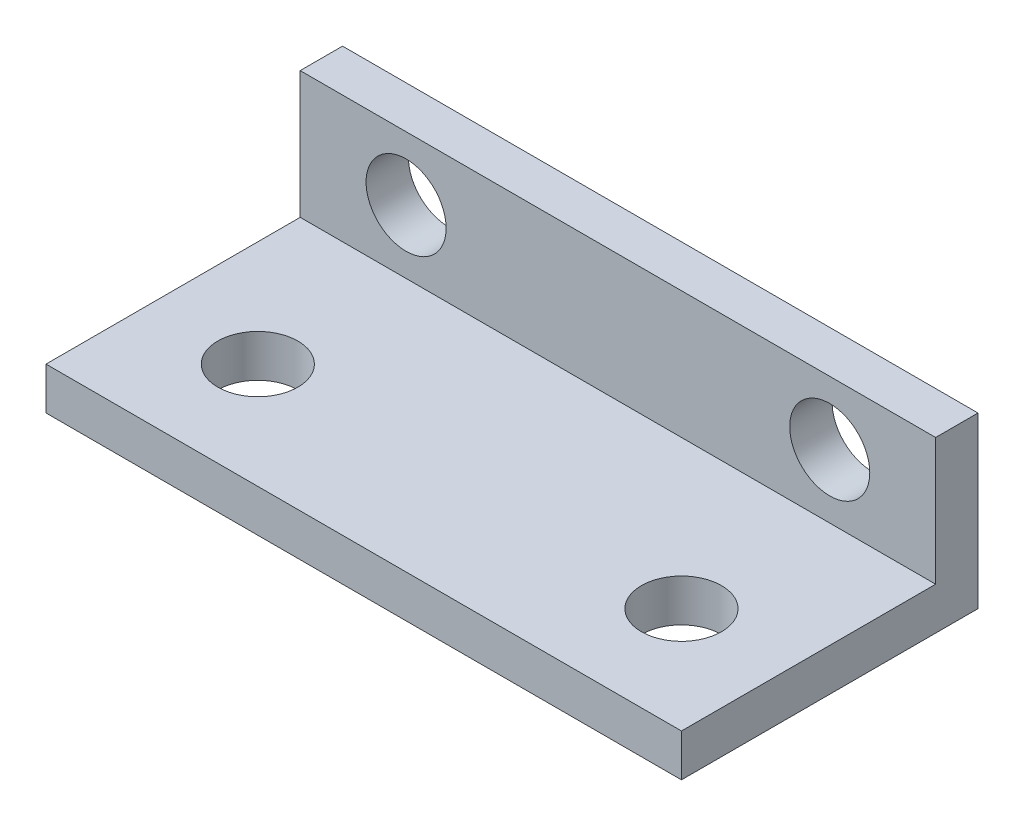
ISO-10303-21;
HEADER;
FILE_DESCRIPTION(('STEP AP214'),'2;1');
FILE_NAME('part.step','',(''),(''),'','','');
FILE_SCHEMA(('AUTOMOTIVE_DESIGN { 1 0 10303 214 1 1 1 1 }'));
ENDSEC;
DATA;
#1=APPLICATION_CONTEXT('core data for automotive mechanical design processes');
#2=APPLICATION_PROTOCOL_DEFINITION('international standard','automotive_design',2000,#1);
#3=PRODUCT_CONTEXT('',#1,'mechanical');
#4=PRODUCT('Part','Part','',(#3));
#5=PRODUCT_RELATED_PRODUCT_CATEGORY('part','',(#4));
#6=PRODUCT_DEFINITION_FORMATION('','',#4);
#7=PRODUCT_DEFINITION_CONTEXT('part definition',#1,'design');
#8=PRODUCT_DEFINITION('design','',#6,#7);
#9=PRODUCT_DEFINITION_SHAPE('','',#8);
#10=(LENGTH_UNIT() NAMED_UNIT(*) SI_UNIT(.MILLI.,.METRE.));
#11=(NAMED_UNIT(*) PLANE_ANGLE_UNIT() SI_UNIT($,.RADIAN.));
#12=(NAMED_UNIT(*) SI_UNIT($,.STERADIAN.) SOLID_ANGLE_UNIT());
#13=UNCERTAINTY_MEASURE_WITH_UNIT(LENGTH_MEASURE(1.E-05),#10,'distance_accuracy_value','');
#14=(GEOMETRIC_REPRESENTATION_CONTEXT(3) GLOBAL_UNCERTAINTY_ASSIGNED_CONTEXT((#13)) GLOBAL_UNIT_ASSIGNED_CONTEXT((#10,
#11,#12)) REPRESENTATION_CONTEXT('',''));
#15=CARTESIAN_POINT('',(0.,0.,0.));
#16=DIRECTION('',(0.,0.,1.));
#17=DIRECTION('',(1.,0.,0.));
#18=AXIS2_PLACEMENT_3D('',#15,#16,#17);
#19=CARTESIAN_POINT('',(38.1,0.,0.));
#20=DIRECTION('',(0.,1.,0.));
#21=DIRECTION('',(0.,0.,1.));
#22=AXIS2_PLACEMENT_3D('',#19,#20,#21);
#23=PLANE('',#22);
#24=CARTESIAN_POINT('',(6.35,0.,1.27));
#25=DIRECTION('',(0.,1.,0.));
#26=DIRECTION('',(0.,0.,1.));
#27=AXIS2_PLACEMENT_3D('',#24,#25,#26);
#28=CIRCLE('',#27,2.4);
#29=CARTESIAN_POINT('',(6.35,0.,3.67));
#30=VERTEX_POINT('',#29);
#31=EDGE_CURVE('E135',#30,#30,#28,.T.);
#32=ORIENTED_EDGE('',*,*,#31,.T.);
#33=EDGE_LOOP('',(#32));
#34=FACE_BOUND('',#33,.T.);
#35=CARTESIAN_POINT('',(31.75,0.,1.27));
#36=DIRECTION('',(0.,1.,0.));
#37=DIRECTION('',(0.,0.,1.));
#38=AXIS2_PLACEMENT_3D('',#35,#36,#37);
#39=CIRCLE('',#38,2.4);
#40=CARTESIAN_POINT('',(31.75,0.,3.67));
#41=VERTEX_POINT('',#40);
#42=EDGE_CURVE('E129',#41,#41,#39,.T.);
#43=ORIENTED_EDGE('',*,*,#42,.T.);
#44=EDGE_LOOP('',(#43));
#45=FACE_BOUND('',#44,.T.);
#46=DIRECTION('',(0.,0.,-1.));
#47=VECTOR('',#46,1.);
#48=CARTESIAN_POINT('',(0.,0.,0.));
#49=LINE('',#48,#47);
#50=CARTESIAN_POINT('',(0.,0.,7.62));
#51=VERTEX_POINT('',#50);
#52=CARTESIAN_POINT('',(0.,0.,-10.16));
#53=VERTEX_POINT('',#52);
#54=EDGE_CURVE('E76',#51,#53,#49,.T.);
#55=ORIENTED_EDGE('',*,*,#54,.T.);
#56=DIRECTION('',(-1.,0.,0.));
#57=VECTOR('',#56,1.);
#58=CARTESIAN_POINT('',(38.1,0.,-10.16));
#59=LINE('',#58,#57);
#60=CARTESIAN_POINT('',(38.1,0.,-10.16));
#61=VERTEX_POINT('',#60);
#62=EDGE_CURVE('E11',#61,#53,#59,.T.);
#63=ORIENTED_EDGE('',*,*,#62,.F.);
#64=DIRECTION('',(0.,0.,-1.));
#65=VECTOR('',#64,1.);
#66=CARTESIAN_POINT('',(38.1,0.,0.));
#67=LINE('',#66,#65);
#68=CARTESIAN_POINT('',(38.1,0.,7.62));
#69=VERTEX_POINT('',#68);
#70=EDGE_CURVE('E85',#69,#61,#67,.T.);
#71=ORIENTED_EDGE('',*,*,#70,.F.);
#72=DIRECTION('',(1.,0.,0.));
#73=VECTOR('',#72,1.);
#74=CARTESIAN_POINT('',(0.,0.,7.62));
#75=LINE('',#74,#73);
#76=EDGE_CURVE('E123',#51,#69,#75,.T.);
#77=ORIENTED_EDGE('',*,*,#76,.F.);
#78=EDGE_LOOP('',(#55,#63,#71,#77));
#79=FACE_BOUND('',#78,.T.);
#80=ADVANCED_FACE('F32',(#34,#45,#79),#23,.F.);
#81=CARTESIAN_POINT('',(38.1,0.,-10.16));
#82=DIRECTION('',(0.,0.,1.));
#83=DIRECTION('',(1.,0.,0.));
#84=AXIS2_PLACEMENT_3D('',#81,#82,#83);
#85=PLANE('',#84);
#86=CARTESIAN_POINT('',(6.35,6.35,-10.16));
#87=DIRECTION('',(0.,0.,1.));
#88=DIRECTION('',(1.,0.,0.));
#89=AXIS2_PLACEMENT_3D('',#86,#87,#88);
#90=CIRCLE('',#89,2.4);
#91=CARTESIAN_POINT('',(8.75,6.35,-10.16));
#92=VERTEX_POINT('',#91);
#93=EDGE_CURVE('E111',#92,#92,#90,.T.);
#94=ORIENTED_EDGE('',*,*,#93,.T.);
#95=EDGE_LOOP('',(#94));
#96=FACE_BOUND('',#95,.T.);
#97=CARTESIAN_POINT('',(31.75,6.35,-10.16));
#98=DIRECTION('',(0.,0.,1.));
#99=DIRECTION('',(1.,0.,0.));
#100=AXIS2_PLACEMENT_3D('',#97,#98,#99);
#101=CIRCLE('',#100,2.4);
#102=CARTESIAN_POINT('',(34.15,6.35,-10.16));
#103=VERTEX_POINT('',#102);
#104=EDGE_CURVE('E105',#103,#103,#101,.T.);
#105=ORIENTED_EDGE('',*,*,#104,.T.);
#106=EDGE_LOOP('',(#105));
#107=FACE_BOUND('',#106,.T.);
#108=DIRECTION('',(0.,1.,0.));
#109=VECTOR('',#108,1.);
#110=CARTESIAN_POINT('',(0.,0.,-10.16));
#111=LINE('',#110,#109);
#112=CARTESIAN_POINT('',(0.,10.16,-10.16));
#113=VERTEX_POINT('',#112);
#114=EDGE_CURVE('E67',#53,#113,#111,.T.);
#115=ORIENTED_EDGE('',*,*,#114,.T.);
#116=DIRECTION('',(-1.,0.,0.));
#117=VECTOR('',#116,1.);
#118=CARTESIAN_POINT('',(38.1,10.16,-10.16));
#119=LINE('',#118,#117);
#120=CARTESIAN_POINT('',(38.1,10.16,-10.16));
#121=VERTEX_POINT('',#120);
#122=EDGE_CURVE('E39',#121,#113,#119,.T.);
#123=ORIENTED_EDGE('',*,*,#122,.F.);
#124=DIRECTION('',(0.,1.,0.));
#125=VECTOR('',#124,1.);
#126=CARTESIAN_POINT('',(38.1,0.,-10.16));
#127=LINE('',#126,#125);
#128=EDGE_CURVE('E55',#61,#121,#127,.T.);
#129=ORIENTED_EDGE('',*,*,#128,.F.);
#130=ORIENTED_EDGE('',*,*,#62,.T.);
#131=EDGE_LOOP('',(#115,#123,#129,#130));
#132=FACE_BOUND('',#131,.T.);
#133=ADVANCED_FACE('F69',(#96,#107,#132),#85,.F.);
#134=CARTESIAN_POINT('',(38.1,10.16,0.));
#135=DIRECTION('',(0.,-1.,0.));
#136=DIRECTION('',(0.,0.,-1.));
#137=AXIS2_PLACEMENT_3D('',#134,#135,#136);
#138=PLANE('',#137);
#139=DIRECTION('',(0.,0.,1.));
#140=VECTOR('',#139,1.);
#141=CARTESIAN_POINT('',(0.,10.16,0.));
#142=LINE('',#141,#140);
#143=CARTESIAN_POINT('',(0.,10.16,-7.62));
#144=VERTEX_POINT('',#143);
#145=EDGE_CURVE('E75',#113,#144,#142,.T.);
#146=ORIENTED_EDGE('',*,*,#145,.T.);
#147=DIRECTION('',(1.,0.,0.));
#148=VECTOR('',#147,1.);
#149=CARTESIAN_POINT('',(-10.776307345283,10.16,-7.62));
#150=LINE('',#149,#148);
#151=CARTESIAN_POINT('',(38.1,10.16,-7.62));
#152=VERTEX_POINT('',#151);
#153=EDGE_CURVE('E46',#144,#152,#150,.T.);
#154=ORIENTED_EDGE('',*,*,#153,.T.);
#155=DIRECTION('',(0.,0.,1.));
#156=VECTOR('',#155,1.);
#157=CARTESIAN_POINT('',(38.1,10.16,0.));
#158=LINE('',#157,#156);
#159=EDGE_CURVE('E81',#121,#152,#158,.T.);
#160=ORIENTED_EDGE('',*,*,#159,.F.);
#161=ORIENTED_EDGE('',*,*,#122,.T.);
#162=EDGE_LOOP('',(#146,#154,#160,#161));
#163=FACE_BOUND('',#162,.T.);
#164=ADVANCED_FACE('F80',(#163),#138,.F.);
#165=CARTESIAN_POINT('',(38.1,0.,0.));
#166=DIRECTION('',(-1.,0.,0.));
#167=DIRECTION('',(0.,0.,1.));
#168=AXIS2_PLACEMENT_3D('',#165,#166,#167);
#169=PLANE('',#168);
#170=DIRECTION('',(0.,-1.,0.));
#171=VECTOR('',#170,1.);
#172=CARTESIAN_POINT('',(38.1,0.,-7.62));
#173=LINE('',#172,#171);
#174=CARTESIAN_POINT('',(38.1,2.54,-7.62));
#175=VERTEX_POINT('',#174);
#176=EDGE_CURVE('E95',#152,#175,#173,.T.);
#177=ORIENTED_EDGE('',*,*,#176,.T.);
#178=DIRECTION('',(0.,0.,1.));
#179=VECTOR('',#178,1.);
#180=CARTESIAN_POINT('',(38.1,2.54,0.));
#181=LINE('',#180,#179);
#182=CARTESIAN_POINT('',(38.1,2.54,7.62));
#183=VERTEX_POINT('',#182);
#184=EDGE_CURVE('E90',#175,#183,#181,.T.);
#185=ORIENTED_EDGE('',*,*,#184,.T.);
#186=DIRECTION('',(0.,1.,0.));
#187=VECTOR('',#186,1.);
#188=CARTESIAN_POINT('',(38.1,2.54,7.62));
#189=LINE('',#188,#187);
#190=EDGE_CURVE('E120',#69,#183,#189,.T.);
#191=ORIENTED_EDGE('',*,*,#190,.F.);
#192=ORIENTED_EDGE('',*,*,#70,.T.);
#193=ORIENTED_EDGE('',*,*,#128,.T.);
#194=ORIENTED_EDGE('',*,*,#159,.T.);
#195=EDGE_LOOP('',(#177,#185,#191,#192,#193,#194));
#196=FACE_BOUND('',#195,.T.);
#197=ADVANCED_FACE('F173',(#196),#169,.F.);
#198=CARTESIAN_POINT('',(0.,0.,0.));
#199=DIRECTION('',(-1.,0.,0.));
#200=DIRECTION('',(0.,0.,1.));
#201=AXIS2_PLACEMENT_3D('',#198,#199,#200);
#202=PLANE('',#201);
#203=DIRECTION('',(0.,0.,-1.));
#204=VECTOR('',#203,1.);
#205=CARTESIAN_POINT('',(0.,2.54,0.));
#206=LINE('',#205,#204);
#207=CARTESIAN_POINT('',(0.,2.54,7.62));
#208=VERTEX_POINT('',#207);
#209=CARTESIAN_POINT('',(0.,2.54,-7.62));
#210=VERTEX_POINT('',#209);
#211=EDGE_CURVE('E101',#208,#210,#206,.T.);
#212=ORIENTED_EDGE('',*,*,#211,.T.);
#213=DIRECTION('',(0.,1.,0.));
#214=VECTOR('',#213,1.);
#215=CARTESIAN_POINT('',(0.,10.16,-7.62));
#216=LINE('',#215,#214);
#217=EDGE_CURVE('E84',#210,#144,#216,.T.);
#218=ORIENTED_EDGE('',*,*,#217,.T.);
#219=ORIENTED_EDGE('',*,*,#145,.F.);
#220=ORIENTED_EDGE('',*,*,#114,.F.);
#221=ORIENTED_EDGE('',*,*,#54,.F.);
#222=DIRECTION('',(0.,-1.,0.));
#223=VECTOR('',#222,1.);
#224=CARTESIAN_POINT('',(0.,2.54,7.62));
#225=LINE('',#224,#223);
#226=EDGE_CURVE('E126',#208,#51,#225,.T.);
#227=ORIENTED_EDGE('',*,*,#226,.F.);
#228=EDGE_LOOP('',(#212,#218,#219,#220,#221,#227));
#229=FACE_BOUND('',#228,.T.);
#230=ADVANCED_FACE('F83',(#229),#202,.T.);
#231=CARTESIAN_POINT('',(-10.776307345283,2.54,0.));
#232=DIRECTION('',(0.,-1.,0.));
#233=DIRECTION('',(0.,0.,-1.));
#234=AXIS2_PLACEMENT_3D('',#231,#232,#233);
#235=PLANE('',#234);
#236=CARTESIAN_POINT('',(6.35,2.54,1.27));
#237=DIRECTION('',(0.,1.,0.));
#238=DIRECTION('',(0.,0.,1.));
#239=AXIS2_PLACEMENT_3D('',#236,#237,#238);
#240=CIRCLE('',#239,2.39999999999999);
#241=CARTESIAN_POINT('',(6.35,2.54,3.66999999999999));
#242=VERTEX_POINT('',#241);
#243=EDGE_CURVE('E138',#242,#242,#240,.T.);
#244=ORIENTED_EDGE('',*,*,#243,.F.);
#245=EDGE_LOOP('',(#244));
#246=FACE_BOUND('',#245,.T.);
#247=CARTESIAN_POINT('',(31.75,2.54,1.27));
#248=DIRECTION('',(0.,1.,0.));
#249=DIRECTION('',(0.,0.,1.));
#250=AXIS2_PLACEMENT_3D('',#247,#248,#249);
#251=CIRCLE('',#250,2.39999999999999);
#252=CARTESIAN_POINT('',(31.75,2.54,3.66999999999998));
#253=VERTEX_POINT('',#252);
#254=EDGE_CURVE('E132',#253,#253,#251,.T.);
#255=ORIENTED_EDGE('',*,*,#254,.F.);
#256=EDGE_LOOP('',(#255));
#257=FACE_BOUND('',#256,.T.);
#258=DIRECTION('',(1.,0.,0.));
#259=VECTOR('',#258,1.);
#260=CARTESIAN_POINT('',(-10.776307345283,2.54,-7.62));
#261=LINE('',#260,#259);
#262=EDGE_CURVE('E98',#210,#175,#261,.T.);
#263=ORIENTED_EDGE('',*,*,#262,.F.);
#264=ORIENTED_EDGE('',*,*,#211,.F.);
#265=DIRECTION('',(-1.,0.,0.));
#266=VECTOR('',#265,1.);
#267=CARTESIAN_POINT('',(0.,2.54,7.62));
#268=LINE('',#267,#266);
#269=EDGE_CURVE('E117',#183,#208,#268,.T.);
#270=ORIENTED_EDGE('',*,*,#269,.F.);
#271=ORIENTED_EDGE('',*,*,#184,.F.);
#272=EDGE_LOOP('',(#263,#264,#270,#271));
#273=FACE_BOUND('',#272,.T.);
#274=ADVANCED_FACE('F144',(#246,#257,#273),#235,.F.);
#275=CARTESIAN_POINT('',(-10.776307345283,10.16,-7.62));
#276=DIRECTION('',(0.,0.,-1.));
#277=DIRECTION('',(-1.,0.,0.));
#278=AXIS2_PLACEMENT_3D('',#275,#276,#277);
#279=PLANE('',#278);
#280=CARTESIAN_POINT('',(6.35,6.35,-7.62));
#281=DIRECTION('',(0.,0.,1.));
#282=DIRECTION('',(1.,0.,0.));
#283=AXIS2_PLACEMENT_3D('',#280,#281,#282);
#284=CIRCLE('',#283,2.39999999999999);
#285=CARTESIAN_POINT('',(8.74999999999999,6.35,-7.62));
#286=VERTEX_POINT('',#285);
#287=EDGE_CURVE('E114',#286,#286,#284,.T.);
#288=ORIENTED_EDGE('',*,*,#287,.F.);
#289=EDGE_LOOP('',(#288));
#290=FACE_BOUND('',#289,.T.);
#291=CARTESIAN_POINT('',(31.75,6.35,-7.62));
#292=DIRECTION('',(0.,0.,1.));
#293=DIRECTION('',(1.,0.,0.));
#294=AXIS2_PLACEMENT_3D('',#291,#292,#293);
#295=CIRCLE('',#294,2.39999999999999);
#296=CARTESIAN_POINT('',(34.15,6.35,-7.62));
#297=VERTEX_POINT('',#296);
#298=EDGE_CURVE('E108',#297,#297,#295,.T.);
#299=ORIENTED_EDGE('',*,*,#298,.F.);
#300=EDGE_LOOP('',(#299));
#301=FACE_BOUND('',#300,.T.);
#302=ORIENTED_EDGE('',*,*,#153,.F.);
#303=ORIENTED_EDGE('',*,*,#217,.F.);
#304=ORIENTED_EDGE('',*,*,#262,.T.);
#305=ORIENTED_EDGE('',*,*,#176,.F.);
#306=EDGE_LOOP('',(#302,#303,#304,#305));
#307=FACE_BOUND('',#306,.T.);
#308=ADVANCED_FACE('F147',(#290,#301,#307),#279,.F.);
#309=CARTESIAN_POINT('',(31.75,6.35,-7.62));
#310=DIRECTION('',(0.,0.,1.));
#311=DIRECTION('',(1.,0.,0.));
#312=AXIS2_PLACEMENT_3D('',#309,#310,#311);
#313=CYLINDRICAL_SURFACE('',#312,2.39999999999999);
#314=ORIENTED_EDGE('',*,*,#104,.F.);
#315=EDGE_LOOP('',(#314));
#316=FACE_BOUND('',#315,.T.);
#317=ORIENTED_EDGE('',*,*,#298,.T.);
#318=EDGE_LOOP('',(#317));
#319=FACE_BOUND('',#318,.T.);
#320=ADVANCED_FACE('F208',(#316,#319),#313,.F.);
#321=CARTESIAN_POINT('',(6.35,6.35,-7.62));
#322=DIRECTION('',(0.,0.,1.));
#323=DIRECTION('',(1.,0.,0.));
#324=AXIS2_PLACEMENT_3D('',#321,#322,#323);
#325=CYLINDRICAL_SURFACE('',#324,2.39999999999999);
#326=ORIENTED_EDGE('',*,*,#93,.F.);
#327=EDGE_LOOP('',(#326));
#328=FACE_BOUND('',#327,.T.);
#329=ORIENTED_EDGE('',*,*,#287,.T.);
#330=EDGE_LOOP('',(#329));
#331=FACE_BOUND('',#330,.T.);
#332=ADVANCED_FACE('F203',(#328,#331),#325,.F.);
#333=CARTESIAN_POINT('',(0.,0.,7.62));
#334=DIRECTION('',(0.,0.,1.));
#335=DIRECTION('',(1.,0.,0.));
#336=AXIS2_PLACEMENT_3D('',#333,#334,#335);
#337=PLANE('',#336);
#338=ORIENTED_EDGE('',*,*,#226,.T.);
#339=ORIENTED_EDGE('',*,*,#76,.T.);
#340=ORIENTED_EDGE('',*,*,#190,.T.);
#341=ORIENTED_EDGE('',*,*,#269,.T.);
#342=EDGE_LOOP('',(#338,#339,#340,#341));
#343=FACE_BOUND('',#342,.T.);
#344=ADVANCED_FACE('F165',(#343),#337,.T.);
#345=CARTESIAN_POINT('',(31.75,2.54,1.27));
#346=DIRECTION('',(0.,1.,0.));
#347=DIRECTION('',(0.,0.,1.));
#348=AXIS2_PLACEMENT_3D('',#345,#346,#347);
#349=CYLINDRICAL_SURFACE('',#348,2.39999999999999);
#350=ORIENTED_EDGE('',*,*,#42,.F.);
#351=EDGE_LOOP('',(#350));
#352=FACE_BOUND('',#351,.T.);
#353=ORIENTED_EDGE('',*,*,#254,.T.);
#354=EDGE_LOOP('',(#353));
#355=FACE_BOUND('',#354,.T.);
#356=ADVANCED_FACE('F193',(#352,#355),#349,.F.);
#357=CARTESIAN_POINT('',(6.35,2.54,1.27));
#358=DIRECTION('',(0.,1.,0.));
#359=DIRECTION('',(0.,0.,1.));
#360=AXIS2_PLACEMENT_3D('',#357,#358,#359);
#361=CYLINDRICAL_SURFACE('',#360,2.39999999999999);
#362=ORIENTED_EDGE('',*,*,#31,.F.);
#363=EDGE_LOOP('',(#362));
#364=FACE_BOUND('',#363,.T.);
#365=ORIENTED_EDGE('',*,*,#243,.T.);
#366=EDGE_LOOP('',(#365));
#367=FACE_BOUND('',#366,.T.);
#368=ADVANCED_FACE('F142',(#364,#367),#361,.F.);
#369=CLOSED_SHELL('',(#80,#133,#164,#197,#230,#274,#308,#320,#332,#344,#356,#368));
#370=MANIFOLD_SOLID_BREP('B2',#369);
#371=ADVANCED_BREP_SHAPE_REPRESENTATION('',(#18,#370),#14);
#372=SHAPE_DEFINITION_REPRESENTATION(#9,#371);
ENDSEC;
END-ISO-10303-21;
